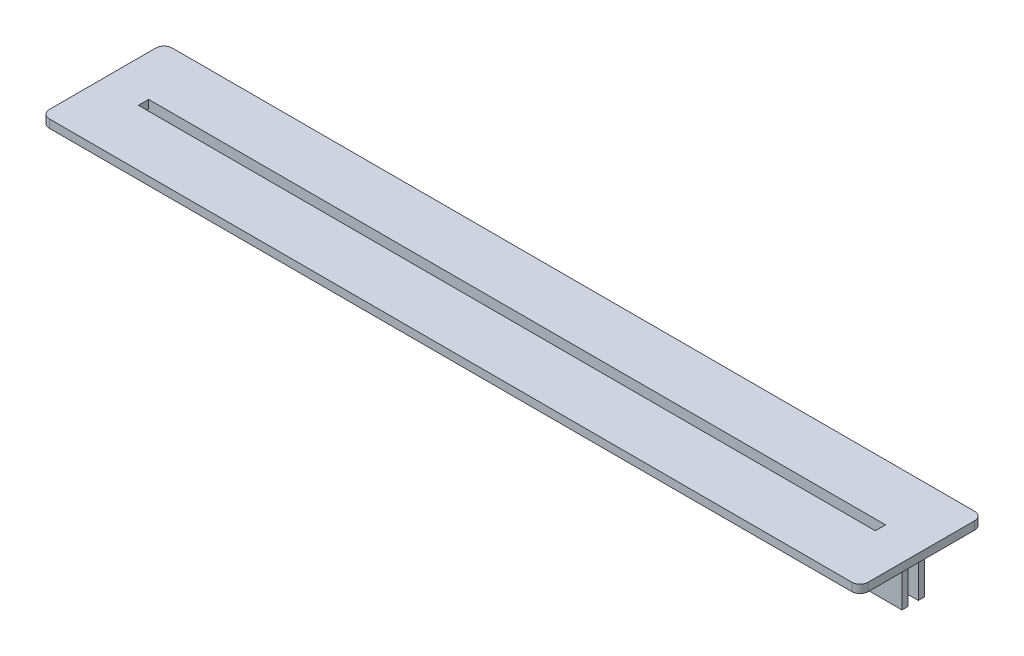
ISO-10303-21;
HEADER;
FILE_DESCRIPTION(('STEP AP214'),'2;1');
FILE_NAME('part.step','',(''),(''),'','','');
FILE_SCHEMA(('AUTOMOTIVE_DESIGN { 1 0 10303 214 1 1 1 1 }'));
ENDSEC;
DATA;
#1=APPLICATION_CONTEXT('core data for automotive mechanical design processes');
#2=APPLICATION_PROTOCOL_DEFINITION('international standard','automotive_design',2000,#1);
#3=PRODUCT_CONTEXT('',#1,'mechanical');
#4=PRODUCT('Part','Part','',(#3));
#5=PRODUCT_RELATED_PRODUCT_CATEGORY('part','',(#4));
#6=PRODUCT_DEFINITION_FORMATION('','',#4);
#7=PRODUCT_DEFINITION_CONTEXT('part definition',#1,'design');
#8=PRODUCT_DEFINITION('design','',#6,#7);
#9=PRODUCT_DEFINITION_SHAPE('','',#8);
#10=(LENGTH_UNIT() NAMED_UNIT(*) SI_UNIT(.MILLI.,.METRE.));
#11=(NAMED_UNIT(*) PLANE_ANGLE_UNIT() SI_UNIT($,.RADIAN.));
#12=(NAMED_UNIT(*) SI_UNIT($,.STERADIAN.) SOLID_ANGLE_UNIT());
#13=UNCERTAINTY_MEASURE_WITH_UNIT(LENGTH_MEASURE(1.E-05),#10,'distance_accuracy_value','');
#14=(GEOMETRIC_REPRESENTATION_CONTEXT(3) GLOBAL_UNCERTAINTY_ASSIGNED_CONTEXT((#13)) GLOBAL_UNIT_ASSIGNED_CONTEXT((#10,
#11,#12)) REPRESENTATION_CONTEXT('',''));
#15=CARTESIAN_POINT('',(0.,0.,0.));
#16=DIRECTION('',(0.,0.,1.));
#17=DIRECTION('',(1.,0.,0.));
#18=AXIS2_PLACEMENT_3D('',#15,#16,#17);
#19=CARTESIAN_POINT('',(124.46,0.,16.51));
#20=DIRECTION('',(0.,1.,0.));
#21=DIRECTION('',(0.,0.,1.));
#22=AXIS2_PLACEMENT_3D('',#19,#20,#21);
#23=PLANE('',#22);
#24=CARTESIAN_POINT('',(124.46,0.,16.51));
#25=DIRECTION('',(0.,1.,0.));
#26=DIRECTION('',(0.,0.,1.));
#27=AXIS2_PLACEMENT_3D('',#24,#25,#26);
#28=CIRCLE('',#27,2.53999999999999);
#29=CARTESIAN_POINT('',(124.46,0.,19.05));
#30=VERTEX_POINT('',#29);
#31=CARTESIAN_POINT('',(127.,0.,16.51));
#32=VERTEX_POINT('',#31);
#33=EDGE_CURVE('E273',#30,#32,#28,.T.);
#34=ORIENTED_EDGE('',*,*,#33,.F.);
#35=DIRECTION('',(1.,0.,0.));
#36=VECTOR('',#35,1.);
#37=CARTESIAN_POINT('',(-124.46,0.,19.05));
#38=LINE('',#37,#36);
#39=CARTESIAN_POINT('',(-124.46,0.,19.05));
#40=VERTEX_POINT('',#39);
#41=EDGE_CURVE('E310',#40,#30,#38,.T.);
#42=ORIENTED_EDGE('',*,*,#41,.F.);
#43=CARTESIAN_POINT('',(-124.46,0.,16.51));
#44=DIRECTION('',(0.,1.,0.));
#45=DIRECTION('',(0.,0.,1.));
#46=AXIS2_PLACEMENT_3D('',#43,#44,#45);
#47=CIRCLE('',#46,2.54);
#48=CARTESIAN_POINT('',(-127.,0.,16.51));
#49=VERTEX_POINT('',#48);
#50=EDGE_CURVE('E350',#49,#40,#47,.T.);
#51=ORIENTED_EDGE('',*,*,#50,.F.);
#52=DIRECTION('',(0.,0.,1.));
#53=VECTOR('',#52,1.);
#54=CARTESIAN_POINT('',(-127.,0.,-16.51));
#55=LINE('',#54,#53);
#56=CARTESIAN_POINT('',(-127.,0.,-16.51));
#57=VERTEX_POINT('',#56);
#58=EDGE_CURVE('E347',#57,#49,#55,.T.);
#59=ORIENTED_EDGE('',*,*,#58,.F.);
#60=CARTESIAN_POINT('',(-124.46,0.,-16.51));
#61=DIRECTION('',(0.,1.,0.));
#62=DIRECTION('',(0.,0.,1.));
#63=AXIS2_PLACEMENT_3D('',#60,#61,#62);
#64=CIRCLE('',#63,2.54);
#65=CARTESIAN_POINT('',(-124.46,0.,-19.05));
#66=VERTEX_POINT('',#65);
#67=EDGE_CURVE('E344',#66,#57,#64,.T.);
#68=ORIENTED_EDGE('',*,*,#67,.F.);
#69=DIRECTION('',(-1.,0.,0.));
#70=VECTOR('',#69,1.);
#71=CARTESIAN_POINT('',(-124.46,0.,-19.05));
#72=LINE('',#71,#70);
#73=CARTESIAN_POINT('',(124.46,0.,-19.05));
#74=VERTEX_POINT('',#73);
#75=EDGE_CURVE('E341',#74,#66,#72,.T.);
#76=ORIENTED_EDGE('',*,*,#75,.F.);
#77=CARTESIAN_POINT('',(124.46,0.,-16.51));
#78=DIRECTION('',(0.,1.,0.));
#79=DIRECTION('',(0.,0.,-1.));
#80=AXIS2_PLACEMENT_3D('',#77,#78,#79);
#81=CIRCLE('',#80,2.53999999999999);
#82=CARTESIAN_POINT('',(127.,0.,-16.51));
#83=VERTEX_POINT('',#82);
#84=EDGE_CURVE('E338',#83,#74,#81,.T.);
#85=ORIENTED_EDGE('',*,*,#84,.F.);
#86=DIRECTION('',(0.,0.,-1.));
#87=VECTOR('',#86,1.);
#88=CARTESIAN_POINT('',(127.,0.,-16.51));
#89=LINE('',#88,#87);
#90=EDGE_CURVE('E335',#32,#83,#89,.T.);
#91=ORIENTED_EDGE('',*,*,#90,.F.);
#92=EDGE_LOOP('',(#34,#42,#51,#59,#68,#76,#85,#91));
#93=FACE_BOUND('',#92,.T.);
#94=DIRECTION('',(-1.,0.,0.));
#95=VECTOR('',#94,1.);
#96=CARTESIAN_POINT('',(124.46,0.,-1.5875));
#97=LINE('',#96,#95);
#98=CARTESIAN_POINT('',(124.46,0.,-1.5875));
#99=VERTEX_POINT('',#98);
#100=CARTESIAN_POINT('',(114.3,0.,-1.5875));
#101=VERTEX_POINT('',#100);
#102=EDGE_CURVE('E636',#99,#101,#97,.T.);
#103=ORIENTED_EDGE('',*,*,#102,.F.);
#104=DIRECTION('',(0.,0.,1.));
#105=VECTOR('',#104,1.);
#106=CARTESIAN_POINT('',(124.46,0.,16.51));
#107=LINE('',#106,#105);
#108=CARTESIAN_POINT('',(124.46,0.,-3.4925));
#109=VERTEX_POINT('',#108);
#110=EDGE_CURVE('E212',#109,#99,#107,.T.);
#111=ORIENTED_EDGE('',*,*,#110,.F.);
#112=DIRECTION('',(1.,0.,0.));
#113=VECTOR('',#112,1.);
#114=CARTESIAN_POINT('',(124.46,0.,-3.4925));
#115=LINE('',#114,#113);
#116=CARTESIAN_POINT('',(-124.46,0.,-3.4925));
#117=VERTEX_POINT('',#116);
#118=EDGE_CURVE('E66',#117,#109,#115,.T.);
#119=ORIENTED_EDGE('',*,*,#118,.F.);
#120=DIRECTION('',(0.,0.,-1.));
#121=VECTOR('',#120,1.);
#122=CARTESIAN_POINT('',(-124.46,0.,16.51));
#123=LINE('',#122,#121);
#124=CARTESIAN_POINT('',(-124.46,0.,-1.5875));
#125=VERTEX_POINT('',#124);
#126=EDGE_CURVE('E61',#125,#117,#123,.T.);
#127=ORIENTED_EDGE('',*,*,#126,.F.);
#128=CARTESIAN_POINT('',(-114.3,0.,-1.5875));
#129=VERTEX_POINT('',#128);
#130=EDGE_CURVE('E217',#129,#125,#97,.T.);
#131=ORIENTED_EDGE('',*,*,#130,.F.);
#132=DIRECTION('',(0.,0.,1.));
#133=VECTOR('',#132,1.);
#134=CARTESIAN_POINT('',(-114.3,0.,16.51));
#135=LINE('',#134,#133);
#136=CARTESIAN_POINT('',(-114.3,0.,1.5875));
#137=VERTEX_POINT('',#136);
#138=EDGE_CURVE('E274',#129,#137,#135,.T.);
#139=ORIENTED_EDGE('',*,*,#138,.T.);
#140=DIRECTION('',(1.,0.,0.));
#141=VECTOR('',#140,1.);
#142=CARTESIAN_POINT('',(124.46,0.,1.5875));
#143=LINE('',#142,#141);
#144=CARTESIAN_POINT('',(-124.46,0.,1.5875));
#145=VERTEX_POINT('',#144);
#146=EDGE_CURVE('E54',#145,#137,#143,.T.);
#147=ORIENTED_EDGE('',*,*,#146,.F.);
#148=DIRECTION('',(0.,0.,-1.));
#149=VECTOR('',#148,1.);
#150=CARTESIAN_POINT('',(-124.46,0.,16.51));
#151=LINE('',#150,#149);
#152=CARTESIAN_POINT('',(-124.46,0.,3.4925));
#153=VERTEX_POINT('',#152);
#154=EDGE_CURVE('E224',#153,#145,#151,.T.);
#155=ORIENTED_EDGE('',*,*,#154,.F.);
#156=DIRECTION('',(-1.,0.,0.));
#157=VECTOR('',#156,1.);
#158=CARTESIAN_POINT('',(124.46,0.,3.4925));
#159=LINE('',#158,#157);
#160=CARTESIAN_POINT('',(124.46,0.,3.4925));
#161=VERTEX_POINT('',#160);
#162=EDGE_CURVE('E219',#161,#153,#159,.T.);
#163=ORIENTED_EDGE('',*,*,#162,.F.);
#164=DIRECTION('',(0.,0.,1.));
#165=VECTOR('',#164,1.);
#166=CARTESIAN_POINT('',(124.46,0.,16.51));
#167=LINE('',#166,#165);
#168=CARTESIAN_POINT('',(124.46,0.,1.5875));
#169=VERTEX_POINT('',#168);
#170=EDGE_CURVE('E235',#169,#161,#167,.T.);
#171=ORIENTED_EDGE('',*,*,#170,.F.);
#172=CARTESIAN_POINT('',(114.3,0.,1.5875));
#173=VERTEX_POINT('',#172);
#174=EDGE_CURVE('E11',#173,#169,#143,.T.);
#175=ORIENTED_EDGE('',*,*,#174,.F.);
#176=DIRECTION('',(0.,0.,-1.));
#177=VECTOR('',#176,1.);
#178=CARTESIAN_POINT('',(114.3,0.,16.51));
#179=LINE('',#178,#177);
#180=EDGE_CURVE('E269',#173,#101,#179,.T.);
#181=ORIENTED_EDGE('',*,*,#180,.T.);
#182=EDGE_LOOP('',(#103,#111,#119,#127,#131,#139,#147,#155,#163,#171,#175,#181));
#183=FACE_BOUND('',#182,.T.);
#184=ADVANCED_FACE('F43',(#93,#183),#23,.F.);
#185=CARTESIAN_POINT('',(124.46,2.54,16.51));
#186=DIRECTION('',(0.,1.,0.));
#187=DIRECTION('',(0.,0.,1.));
#188=AXIS2_PLACEMENT_3D('',#185,#186,#187);
#189=PLANE('',#188);
#190=CARTESIAN_POINT('',(124.46,2.54,16.51));
#191=DIRECTION('',(0.,1.,0.));
#192=DIRECTION('',(0.,0.,1.));
#193=AXIS2_PLACEMENT_3D('',#190,#191,#192);
#194=CIRCLE('',#193,2.53999999999999);
#195=CARTESIAN_POINT('',(124.46,2.54,19.05));
#196=VERTEX_POINT('',#195);
#197=CARTESIAN_POINT('',(127.,2.54,16.51));
#198=VERTEX_POINT('',#197);
#199=EDGE_CURVE('E305',#196,#198,#194,.T.);
#200=ORIENTED_EDGE('',*,*,#199,.T.);
#201=DIRECTION('',(0.,0.,-1.));
#202=VECTOR('',#201,1.);
#203=CARTESIAN_POINT('',(127.,2.54,-16.51));
#204=LINE('',#203,#202);
#205=CARTESIAN_POINT('',(127.,2.54,-16.51));
#206=VERTEX_POINT('',#205);
#207=EDGE_CURVE('E309',#198,#206,#204,.T.);
#208=ORIENTED_EDGE('',*,*,#207,.T.);
#209=CARTESIAN_POINT('',(124.46,2.54,-16.51));
#210=DIRECTION('',(0.,1.,0.));
#211=DIRECTION('',(0.,0.,-1.));
#212=AXIS2_PLACEMENT_3D('',#209,#210,#211);
#213=CIRCLE('',#212,2.53999999999999);
#214=CARTESIAN_POINT('',(124.46,2.54,-19.05));
#215=VERTEX_POINT('',#214);
#216=EDGE_CURVE('E313',#206,#215,#213,.T.);
#217=ORIENTED_EDGE('',*,*,#216,.T.);
#218=DIRECTION('',(-1.,0.,0.));
#219=VECTOR('',#218,1.);
#220=CARTESIAN_POINT('',(-124.46,2.54,-19.05));
#221=LINE('',#220,#219);
#222=CARTESIAN_POINT('',(-124.46,2.54,-19.05));
#223=VERTEX_POINT('',#222);
#224=EDGE_CURVE('E316',#215,#223,#221,.T.);
#225=ORIENTED_EDGE('',*,*,#224,.T.);
#226=CARTESIAN_POINT('',(-124.46,2.54,-16.51));
#227=DIRECTION('',(0.,1.,0.));
#228=DIRECTION('',(0.,0.,1.));
#229=AXIS2_PLACEMENT_3D('',#226,#227,#228);
#230=CIRCLE('',#229,2.54);
#231=CARTESIAN_POINT('',(-127.,2.54,-16.51));
#232=VERTEX_POINT('',#231);
#233=EDGE_CURVE('E319',#223,#232,#230,.T.);
#234=ORIENTED_EDGE('',*,*,#233,.T.);
#235=DIRECTION('',(0.,0.,1.));
#236=VECTOR('',#235,1.);
#237=CARTESIAN_POINT('',(-127.,2.54,-16.51));
#238=LINE('',#237,#236);
#239=CARTESIAN_POINT('',(-127.,2.54,16.51));
#240=VERTEX_POINT('',#239);
#241=EDGE_CURVE('E322',#232,#240,#238,.T.);
#242=ORIENTED_EDGE('',*,*,#241,.T.);
#243=CARTESIAN_POINT('',(-124.46,2.54,16.51));
#244=DIRECTION('',(0.,1.,0.));
#245=DIRECTION('',(0.,0.,1.));
#246=AXIS2_PLACEMENT_3D('',#243,#244,#245);
#247=CIRCLE('',#246,2.54);
#248=CARTESIAN_POINT('',(-124.46,2.54,19.05));
#249=VERTEX_POINT('',#248);
#250=EDGE_CURVE('E325',#240,#249,#247,.T.);
#251=ORIENTED_EDGE('',*,*,#250,.T.);
#252=DIRECTION('',(1.,0.,0.));
#253=VECTOR('',#252,1.);
#254=CARTESIAN_POINT('',(-124.46,2.54,19.05));
#255=LINE('',#254,#253);
#256=EDGE_CURVE('E328',#249,#196,#255,.T.);
#257=ORIENTED_EDGE('',*,*,#256,.T.);
#258=EDGE_LOOP('',(#200,#208,#217,#225,#234,#242,#251,#257));
#259=FACE_BOUND('',#258,.T.);
#260=DIRECTION('',(-1.,0.,0.));
#261=VECTOR('',#260,1.);
#262=CARTESIAN_POINT('',(124.46,2.54,1.5875));
#263=LINE('',#262,#261);
#264=CARTESIAN_POINT('',(114.3,2.54,1.5875));
#265=VERTEX_POINT('',#264);
#266=CARTESIAN_POINT('',(-114.3,2.54,1.5875));
#267=VERTEX_POINT('',#266);
#268=EDGE_CURVE('E282',#265,#267,#263,.T.);
#269=ORIENTED_EDGE('',*,*,#268,.T.);
#270=DIRECTION('',(0.,0.,-1.));
#271=VECTOR('',#270,1.);
#272=CARTESIAN_POINT('',(-114.3,2.54,16.51));
#273=LINE('',#272,#271);
#274=CARTESIAN_POINT('',(-114.3,2.54,-1.5875));
#275=VERTEX_POINT('',#274);
#276=EDGE_CURVE('E286',#267,#275,#273,.T.);
#277=ORIENTED_EDGE('',*,*,#276,.T.);
#278=DIRECTION('',(1.,0.,0.));
#279=VECTOR('',#278,1.);
#280=CARTESIAN_POINT('',(124.46,2.54,-1.5875));
#281=LINE('',#280,#279);
#282=CARTESIAN_POINT('',(114.3,2.54,-1.5875));
#283=VERTEX_POINT('',#282);
#284=EDGE_CURVE('E268',#275,#283,#281,.T.);
#285=ORIENTED_EDGE('',*,*,#284,.T.);
#286=DIRECTION('',(0.,0.,1.));
#287=VECTOR('',#286,1.);
#288=CARTESIAN_POINT('',(114.3,2.54,16.51));
#289=LINE('',#288,#287);
#290=EDGE_CURVE('E278',#283,#265,#289,.T.);
#291=ORIENTED_EDGE('',*,*,#290,.T.);
#292=EDGE_LOOP('',(#269,#277,#285,#291));
#293=FACE_BOUND('',#292,.T.);
#294=ADVANCED_FACE('F406',(#259,#293),#189,.T.);
#295=CARTESIAN_POINT('',(124.46,2.54,16.51));
#296=DIRECTION('',(0.,-1.,0.));
#297=DIRECTION('',(0.,0.,-1.));
#298=AXIS2_PLACEMENT_3D('',#295,#296,#297);
#299=CYLINDRICAL_SURFACE('',#298,2.53999999999999);
#300=ORIENTED_EDGE('',*,*,#33,.T.);
#301=DIRECTION('',(0.,-1.,0.));
#302=VECTOR('',#301,1.);
#303=CARTESIAN_POINT('',(127.,2.54,16.51));
#304=LINE('',#303,#302);
#305=EDGE_CURVE('E47',#198,#32,#304,.T.);
#306=ORIENTED_EDGE('',*,*,#305,.F.);
#307=ORIENTED_EDGE('',*,*,#199,.F.);
#308=DIRECTION('',(0.,-1.,0.));
#309=VECTOR('',#308,1.);
#310=CARTESIAN_POINT('',(124.46,2.54,19.05));
#311=LINE('',#310,#309);
#312=EDGE_CURVE('E331',#196,#30,#311,.T.);
#313=ORIENTED_EDGE('',*,*,#312,.T.);
#314=EDGE_LOOP('',(#300,#306,#307,#313));
#315=FACE_BOUND('',#314,.T.);
#316=ADVANCED_FACE('F45',(#315),#299,.T.);
#317=CARTESIAN_POINT('',(127.,2.54,-16.51));
#318=DIRECTION('',(-1.,0.,0.));
#319=DIRECTION('',(0.,0.,1.));
#320=AXIS2_PLACEMENT_3D('',#317,#318,#319);
#321=PLANE('',#320);
#322=ORIENTED_EDGE('',*,*,#90,.T.);
#323=DIRECTION('',(0.,-1.,0.));
#324=VECTOR('',#323,1.);
#325=CARTESIAN_POINT('',(127.,2.54,-16.51));
#326=LINE('',#325,#324);
#327=EDGE_CURVE('E377',#206,#83,#326,.T.);
#328=ORIENTED_EDGE('',*,*,#327,.F.);
#329=ORIENTED_EDGE('',*,*,#207,.F.);
#330=ORIENTED_EDGE('',*,*,#305,.T.);
#331=EDGE_LOOP('',(#322,#328,#329,#330));
#332=FACE_BOUND('',#331,.T.);
#333=ADVANCED_FACE('F388',(#332),#321,.F.);
#334=CARTESIAN_POINT('',(124.46,2.54,-16.51));
#335=DIRECTION('',(0.,-1.,0.));
#336=DIRECTION('',(0.,0.,-1.));
#337=AXIS2_PLACEMENT_3D('',#334,#335,#336);
#338=CYLINDRICAL_SURFACE('',#337,2.53999999999999);
#339=ORIENTED_EDGE('',*,*,#84,.T.);
#340=DIRECTION('',(0.,-1.,0.));
#341=VECTOR('',#340,1.);
#342=CARTESIAN_POINT('',(124.46,2.54,-19.05));
#343=LINE('',#342,#341);
#344=EDGE_CURVE('E374',#215,#74,#343,.T.);
#345=ORIENTED_EDGE('',*,*,#344,.F.);
#346=ORIENTED_EDGE('',*,*,#216,.F.);
#347=ORIENTED_EDGE('',*,*,#327,.T.);
#348=EDGE_LOOP('',(#339,#345,#346,#347));
#349=FACE_BOUND('',#348,.T.);
#350=ADVANCED_FACE('F399',(#349),#338,.T.);
#351=CARTESIAN_POINT('',(-124.46,2.54,-19.05));
#352=DIRECTION('',(0.,0.,1.));
#353=DIRECTION('',(1.,0.,0.));
#354=AXIS2_PLACEMENT_3D('',#351,#352,#353);
#355=PLANE('',#354);
#356=ORIENTED_EDGE('',*,*,#75,.T.);
#357=DIRECTION('',(0.,-1.,0.));
#358=VECTOR('',#357,1.);
#359=CARTESIAN_POINT('',(-124.46,2.54,-19.05));
#360=LINE('',#359,#358);
#361=EDGE_CURVE('E370',#223,#66,#360,.T.);
#362=ORIENTED_EDGE('',*,*,#361,.F.);
#363=ORIENTED_EDGE('',*,*,#224,.F.);
#364=ORIENTED_EDGE('',*,*,#344,.T.);
#365=EDGE_LOOP('',(#356,#362,#363,#364));
#366=FACE_BOUND('',#365,.T.);
#367=ADVANCED_FACE('F402',(#366),#355,.F.);
#368=CARTESIAN_POINT('',(-124.46,2.54,-16.51));
#369=DIRECTION('',(0.,-1.,0.));
#370=DIRECTION('',(0.,0.,-1.));
#371=AXIS2_PLACEMENT_3D('',#368,#369,#370);
#372=CYLINDRICAL_SURFACE('',#371,2.54);
#373=ORIENTED_EDGE('',*,*,#67,.T.);
#374=DIRECTION('',(0.,-1.,0.));
#375=VECTOR('',#374,1.);
#376=CARTESIAN_POINT('',(-127.,2.54,-16.51));
#377=LINE('',#376,#375);
#378=EDGE_CURVE('E366',#232,#57,#377,.T.);
#379=ORIENTED_EDGE('',*,*,#378,.F.);
#380=ORIENTED_EDGE('',*,*,#233,.F.);
#381=ORIENTED_EDGE('',*,*,#361,.T.);
#382=EDGE_LOOP('',(#373,#379,#380,#381));
#383=FACE_BOUND('',#382,.T.);
#384=ADVANCED_FACE('F422',(#383),#372,.T.);
#385=CARTESIAN_POINT('',(-127.,2.54,-16.51));
#386=DIRECTION('',(1.,0.,0.));
#387=DIRECTION('',(0.,0.,-1.));
#388=AXIS2_PLACEMENT_3D('',#385,#386,#387);
#389=PLANE('',#388);
#390=ORIENTED_EDGE('',*,*,#58,.T.);
#391=DIRECTION('',(0.,-1.,0.));
#392=VECTOR('',#391,1.);
#393=CARTESIAN_POINT('',(-127.,2.54,16.51));
#394=LINE('',#393,#392);
#395=EDGE_CURVE('E362',#240,#49,#394,.T.);
#396=ORIENTED_EDGE('',*,*,#395,.F.);
#397=ORIENTED_EDGE('',*,*,#241,.F.);
#398=ORIENTED_EDGE('',*,*,#378,.T.);
#399=EDGE_LOOP('',(#390,#396,#397,#398));
#400=FACE_BOUND('',#399,.T.);
#401=ADVANCED_FACE('F419',(#400),#389,.F.);
#402=CARTESIAN_POINT('',(-124.46,2.54,16.51));
#403=DIRECTION('',(0.,-1.,0.));
#404=DIRECTION('',(0.,0.,-1.));
#405=AXIS2_PLACEMENT_3D('',#402,#403,#404);
#406=CYLINDRICAL_SURFACE('',#405,2.54);
#407=ORIENTED_EDGE('',*,*,#50,.T.);
#408=DIRECTION('',(0.,-1.,0.));
#409=VECTOR('',#408,1.);
#410=CARTESIAN_POINT('',(-124.46,2.54,19.05));
#411=LINE('',#410,#409);
#412=EDGE_CURVE('E358',#249,#40,#411,.T.);
#413=ORIENTED_EDGE('',*,*,#412,.F.);
#414=ORIENTED_EDGE('',*,*,#250,.F.);
#415=ORIENTED_EDGE('',*,*,#395,.T.);
#416=EDGE_LOOP('',(#407,#413,#414,#415));
#417=FACE_BOUND('',#416,.T.);
#418=ADVANCED_FACE('F415',(#417),#406,.T.);
#419=CARTESIAN_POINT('',(-124.46,2.54,19.05));
#420=DIRECTION('',(0.,0.,-1.));
#421=DIRECTION('',(-1.,0.,0.));
#422=AXIS2_PLACEMENT_3D('',#419,#420,#421);
#423=PLANE('',#422);
#424=ORIENTED_EDGE('',*,*,#41,.T.);
#425=ORIENTED_EDGE('',*,*,#312,.F.);
#426=ORIENTED_EDGE('',*,*,#256,.F.);
#427=ORIENTED_EDGE('',*,*,#412,.T.);
#428=EDGE_LOOP('',(#424,#425,#426,#427));
#429=FACE_BOUND('',#428,.T.);
#430=ADVANCED_FACE('F413',(#429),#423,.F.);
#431=CARTESIAN_POINT('',(-114.3,-228.622047547913,16.51));
#432=DIRECTION('',(1.,0.,0.));
#433=DIRECTION('',(0.,0.,-1.));
#434=AXIS2_PLACEMENT_3D('',#431,#432,#433);
#435=PLANE('',#434);
#436=DIRECTION('',(0.,1.,0.));
#437=VECTOR('',#436,1.);
#438=CARTESIAN_POINT('',(-114.3,-228.622047547913,-1.5875));
#439=LINE('',#438,#437);
#440=EDGE_CURVE('E290',#129,#275,#439,.T.);
#441=ORIENTED_EDGE('',*,*,#440,.T.);
#442=ORIENTED_EDGE('',*,*,#276,.F.);
#443=DIRECTION('',(0.,1.,0.));
#444=VECTOR('',#443,1.);
#445=CARTESIAN_POINT('',(-114.3,-228.622047547913,1.5875));
#446=LINE('',#445,#444);
#447=EDGE_CURVE('E293',#137,#267,#446,.T.);
#448=ORIENTED_EDGE('',*,*,#447,.F.);
#449=ORIENTED_EDGE('',*,*,#138,.F.);
#450=EDGE_LOOP('',(#441,#442,#448,#449));
#451=FACE_BOUND('',#450,.T.);
#452=ADVANCED_FACE('F441',(#451),#435,.T.);
#453=CARTESIAN_POINT('',(124.46,-228.622047547913,1.5875));
#454=DIRECTION('',(0.,0.,-1.));
#455=DIRECTION('',(-1.,0.,0.));
#456=AXIS2_PLACEMENT_3D('',#453,#454,#455);
#457=PLANE('',#456);
#458=ORIENTED_EDGE('',*,*,#447,.T.);
#459=ORIENTED_EDGE('',*,*,#268,.F.);
#460=DIRECTION('',(0.,1.,0.));
#461=VECTOR('',#460,1.);
#462=CARTESIAN_POINT('',(114.3,-228.622047547913,1.5875));
#463=LINE('',#462,#461);
#464=EDGE_CURVE('E296',#173,#265,#463,.T.);
#465=ORIENTED_EDGE('',*,*,#464,.F.);
#466=ORIENTED_EDGE('',*,*,#174,.T.);
#467=DIRECTION('',(0.,1.,0.));
#468=VECTOR('',#467,1.);
#469=CARTESIAN_POINT('',(124.46,-12.7,1.5875));
#470=LINE('',#469,#468);
#471=CARTESIAN_POINT('',(124.46,-12.7,1.5875));
#472=VERTEX_POINT('',#471);
#473=EDGE_CURVE('E256',#472,#169,#470,.T.);
#474=ORIENTED_EDGE('',*,*,#473,.F.);
#475=DIRECTION('',(1.,0.,0.));
#476=VECTOR('',#475,1.);
#477=CARTESIAN_POINT('',(124.46,-12.7,1.5875));
#478=LINE('',#477,#476);
#479=CARTESIAN_POINT('',(-124.46,-12.7,1.5875));
#480=VERTEX_POINT('',#479);
#481=EDGE_CURVE('E238',#480,#472,#478,.T.);
#482=ORIENTED_EDGE('',*,*,#481,.F.);
#483=DIRECTION('',(0.,1.,0.));
#484=VECTOR('',#483,1.);
#485=CARTESIAN_POINT('',(-124.46,-12.7,1.5875));
#486=LINE('',#485,#484);
#487=EDGE_CURVE('E260',#480,#145,#486,.T.);
#488=ORIENTED_EDGE('',*,*,#487,.T.);
#489=ORIENTED_EDGE('',*,*,#146,.T.);
#490=EDGE_LOOP('',(#458,#459,#465,#466,#474,#482,#488,#489));
#491=FACE_BOUND('',#490,.T.);
#492=ADVANCED_FACE('F458',(#491),#457,.T.);
#493=CARTESIAN_POINT('',(114.3,-228.622047547913,16.51));
#494=DIRECTION('',(-1.,0.,0.));
#495=DIRECTION('',(0.,0.,1.));
#496=AXIS2_PLACEMENT_3D('',#493,#494,#495);
#497=PLANE('',#496);
#498=ORIENTED_EDGE('',*,*,#464,.T.);
#499=ORIENTED_EDGE('',*,*,#290,.F.);
#500=DIRECTION('',(0.,1.,0.));
#501=VECTOR('',#500,1.);
#502=CARTESIAN_POINT('',(114.3,-228.622047547913,-1.5875));
#503=LINE('',#502,#501);
#504=EDGE_CURVE('E299',#101,#283,#503,.T.);
#505=ORIENTED_EDGE('',*,*,#504,.F.);
#506=ORIENTED_EDGE('',*,*,#180,.F.);
#507=EDGE_LOOP('',(#498,#499,#505,#506));
#508=FACE_BOUND('',#507,.T.);
#509=ADVANCED_FACE('F467',(#508),#497,.T.);
#510=CARTESIAN_POINT('',(124.46,-228.622047547913,-1.5875));
#511=DIRECTION('',(0.,0.,1.));
#512=DIRECTION('',(1.,0.,0.));
#513=AXIS2_PLACEMENT_3D('',#510,#511,#512);
#514=PLANE('',#513);
#515=ORIENTED_EDGE('',*,*,#504,.T.);
#516=ORIENTED_EDGE('',*,*,#284,.F.);
#517=ORIENTED_EDGE('',*,*,#440,.F.);
#518=ORIENTED_EDGE('',*,*,#130,.T.);
#519=DIRECTION('',(0.,1.,0.));
#520=VECTOR('',#519,1.);
#521=CARTESIAN_POINT('',(-124.46,-12.7,-1.5875));
#522=LINE('',#521,#520);
#523=CARTESIAN_POINT('',(-124.46,-12.7,-1.5875));
#524=VERTEX_POINT('',#523);
#525=EDGE_CURVE('E195',#524,#125,#522,.T.);
#526=ORIENTED_EDGE('',*,*,#525,.F.);
#527=DIRECTION('',(-1.,0.,0.));
#528=VECTOR('',#527,1.);
#529=CARTESIAN_POINT('',(124.46,-12.7,-1.5875));
#530=LINE('',#529,#528);
#531=CARTESIAN_POINT('',(124.46,-12.7,-1.5875));
#532=VERTEX_POINT('',#531);
#533=EDGE_CURVE('E202',#532,#524,#530,.T.);
#534=ORIENTED_EDGE('',*,*,#533,.F.);
#535=DIRECTION('',(0.,1.,0.));
#536=VECTOR('',#535,1.);
#537=CARTESIAN_POINT('',(124.46,-12.7,-1.5875));
#538=LINE('',#537,#536);
#539=EDGE_CURVE('E631',#532,#99,#538,.T.);
#540=ORIENTED_EDGE('',*,*,#539,.T.);
#541=ORIENTED_EDGE('',*,*,#102,.T.);
#542=EDGE_LOOP('',(#515,#516,#517,#518,#526,#534,#540,#541));
#543=FACE_BOUND('',#542,.T.);
#544=ADVANCED_FACE('F215',(#543),#514,.T.);
#545=CARTESIAN_POINT('',(124.46,-12.7,3.4925));
#546=DIRECTION('',(0.,0.,-1.));
#547=DIRECTION('',(-1.,0.,0.));
#548=AXIS2_PLACEMENT_3D('',#545,#546,#547);
#549=PLANE('',#548);
#550=ORIENTED_EDGE('',*,*,#162,.T.);
#551=DIRECTION('',(0.,1.,0.));
#552=VECTOR('',#551,1.);
#553=CARTESIAN_POINT('',(-124.46,-12.7,3.4925));
#554=LINE('',#553,#552);
#555=CARTESIAN_POINT('',(-124.46,-12.7,3.4925));
#556=VERTEX_POINT('',#555);
#557=EDGE_CURVE('E264',#556,#153,#554,.T.);
#558=ORIENTED_EDGE('',*,*,#557,.F.);
#559=DIRECTION('',(-1.,0.,0.));
#560=VECTOR('',#559,1.);
#561=CARTESIAN_POINT('',(124.46,-12.7,3.4925));
#562=LINE('',#561,#560);
#563=CARTESIAN_POINT('',(124.46,-12.7,3.4925));
#564=VERTEX_POINT('',#563);
#565=EDGE_CURVE('E230',#564,#556,#562,.T.);
#566=ORIENTED_EDGE('',*,*,#565,.F.);
#567=DIRECTION('',(0.,1.,0.));
#568=VECTOR('',#567,1.);
#569=CARTESIAN_POINT('',(124.46,-12.7,3.4925));
#570=LINE('',#569,#568);
#571=EDGE_CURVE('E243',#564,#161,#570,.T.);
#572=ORIENTED_EDGE('',*,*,#571,.T.);
#573=EDGE_LOOP('',(#550,#558,#566,#572));
#574=FACE_BOUND('',#573,.T.);
#575=ADVANCED_FACE('F482',(#574),#549,.F.);
#576=CARTESIAN_POINT('',(-124.46,-12.7,16.51));
#577=DIRECTION('',(1.,0.,0.));
#578=DIRECTION('',(0.,0.,-1.));
#579=AXIS2_PLACEMENT_3D('',#576,#577,#578);
#580=PLANE('',#579);
#581=ORIENTED_EDGE('',*,*,#154,.T.);
#582=ORIENTED_EDGE('',*,*,#487,.F.);
#583=DIRECTION('',(0.,0.,-1.));
#584=VECTOR('',#583,1.);
#585=CARTESIAN_POINT('',(-124.46,-12.7,16.51));
#586=LINE('',#585,#584);
#587=EDGE_CURVE('E234',#556,#480,#586,.T.);
#588=ORIENTED_EDGE('',*,*,#587,.F.);
#589=ORIENTED_EDGE('',*,*,#557,.T.);
#590=EDGE_LOOP('',(#581,#582,#588,#589));
#591=FACE_BOUND('',#590,.T.);
#592=ADVANCED_FACE('F486',(#591),#580,.F.);
#593=CARTESIAN_POINT('',(124.46,-12.7,16.51));
#594=DIRECTION('',(-1.,0.,0.));
#595=DIRECTION('',(0.,0.,1.));
#596=AXIS2_PLACEMENT_3D('',#593,#594,#595);
#597=PLANE('',#596);
#598=ORIENTED_EDGE('',*,*,#170,.T.);
#599=ORIENTED_EDGE('',*,*,#571,.F.);
#600=DIRECTION('',(0.,0.,1.));
#601=VECTOR('',#600,1.);
#602=CARTESIAN_POINT('',(124.46,-12.7,16.51));
#603=LINE('',#602,#601);
#604=EDGE_CURVE('E241',#472,#564,#603,.T.);
#605=ORIENTED_EDGE('',*,*,#604,.F.);
#606=ORIENTED_EDGE('',*,*,#473,.T.);
#607=EDGE_LOOP('',(#598,#599,#605,#606));
#608=FACE_BOUND('',#607,.T.);
#609=ADVANCED_FACE('F494',(#608),#597,.F.);
#610=CARTESIAN_POINT('',(0.,-12.7,0.));
#611=DIRECTION('',(0.,-1.,0.));
#612=DIRECTION('',(0.,0.,-1.));
#613=AXIS2_PLACEMENT_3D('',#610,#611,#612);
#614=PLANE('',#613);
#615=ORIENTED_EDGE('',*,*,#565,.T.);
#616=ORIENTED_EDGE('',*,*,#587,.T.);
#617=ORIENTED_EDGE('',*,*,#481,.T.);
#618=ORIENTED_EDGE('',*,*,#604,.T.);
#619=EDGE_LOOP('',(#615,#616,#617,#618));
#620=FACE_BOUND('',#619,.T.);
#621=ADVANCED_FACE('F502',(#620),#614,.T.);
#622=CARTESIAN_POINT('',(-124.46,-12.7,16.51));
#623=DIRECTION('',(1.,0.,0.));
#624=DIRECTION('',(0.,0.,-1.));
#625=AXIS2_PLACEMENT_3D('',#622,#623,#624);
#626=PLANE('',#625);
#627=ORIENTED_EDGE('',*,*,#126,.T.);
#628=DIRECTION('',(0.,1.,0.));
#629=VECTOR('',#628,1.);
#630=CARTESIAN_POINT('',(-124.46,-12.7,-3.4925));
#631=LINE('',#630,#629);
#632=CARTESIAN_POINT('',(-124.46,-12.7,-3.4925));
#633=VERTEX_POINT('',#632);
#634=EDGE_CURVE('E197',#633,#117,#631,.T.);
#635=ORIENTED_EDGE('',*,*,#634,.F.);
#636=DIRECTION('',(0.,0.,-1.));
#637=VECTOR('',#636,1.);
#638=CARTESIAN_POINT('',(-124.46,-12.7,16.51));
#639=LINE('',#638,#637);
#640=EDGE_CURVE('E191',#524,#633,#639,.T.);
#641=ORIENTED_EDGE('',*,*,#640,.F.);
#642=ORIENTED_EDGE('',*,*,#525,.T.);
#643=EDGE_LOOP('',(#627,#635,#641,#642));
#644=FACE_BOUND('',#643,.T.);
#645=ADVANCED_FACE('F193',(#644),#626,.F.);
#646=CARTESIAN_POINT('',(124.46,-12.7,-3.4925));
#647=DIRECTION('',(0.,0.,1.));
#648=DIRECTION('',(1.,0.,0.));
#649=AXIS2_PLACEMENT_3D('',#646,#647,#648);
#650=PLANE('',#649);
#651=ORIENTED_EDGE('',*,*,#118,.T.);
#652=DIRECTION('',(0.,1.,0.));
#653=VECTOR('',#652,1.);
#654=CARTESIAN_POINT('',(124.46,-12.7,-3.4925));
#655=LINE('',#654,#653);
#656=CARTESIAN_POINT('',(124.46,-12.7,-3.4925));
#657=VERTEX_POINT('',#656);
#658=EDGE_CURVE('E226',#657,#109,#655,.T.);
#659=ORIENTED_EDGE('',*,*,#658,.F.);
#660=DIRECTION('',(1.,0.,0.));
#661=VECTOR('',#660,1.);
#662=CARTESIAN_POINT('',(124.46,-12.7,-3.4925));
#663=LINE('',#662,#661);
#664=EDGE_CURVE('E201',#633,#657,#663,.T.);
#665=ORIENTED_EDGE('',*,*,#664,.F.);
#666=ORIENTED_EDGE('',*,*,#634,.T.);
#667=EDGE_LOOP('',(#651,#659,#665,#666));
#668=FACE_BOUND('',#667,.T.);
#669=ADVANCED_FACE('F518',(#668),#650,.F.);
#670=CARTESIAN_POINT('',(124.46,-12.7,16.51));
#671=DIRECTION('',(-1.,0.,0.));
#672=DIRECTION('',(0.,0.,1.));
#673=AXIS2_PLACEMENT_3D('',#670,#671,#672);
#674=PLANE('',#673);
#675=ORIENTED_EDGE('',*,*,#110,.T.);
#676=ORIENTED_EDGE('',*,*,#539,.F.);
#677=DIRECTION('',(0.,0.,1.));
#678=VECTOR('',#677,1.);
#679=CARTESIAN_POINT('',(124.46,-12.7,16.51));
#680=LINE('',#679,#678);
#681=EDGE_CURVE('E207',#657,#532,#680,.T.);
#682=ORIENTED_EDGE('',*,*,#681,.F.);
#683=ORIENTED_EDGE('',*,*,#658,.T.);
#684=EDGE_LOOP('',(#675,#676,#682,#683));
#685=FACE_BOUND('',#684,.T.);
#686=ADVANCED_FACE('F525',(#685),#674,.F.);
#687=CARTESIAN_POINT('',(0.,-12.7,0.));
#688=DIRECTION('',(0.,-1.,0.));
#689=DIRECTION('',(0.,0.,-1.));
#690=AXIS2_PLACEMENT_3D('',#687,#688,#689);
#691=PLANE('',#690);
#692=ORIENTED_EDGE('',*,*,#533,.T.);
#693=ORIENTED_EDGE('',*,*,#640,.T.);
#694=ORIENTED_EDGE('',*,*,#664,.T.);
#695=ORIENTED_EDGE('',*,*,#681,.T.);
#696=EDGE_LOOP('',(#692,#693,#694,#695));
#697=FACE_BOUND('',#696,.T.);
#698=ADVANCED_FACE('F205',(#697),#691,.T.);
#699=CLOSED_SHELL('',(#184,#294,#316,#333,#350,#367,#384,#401,#418,#430,#452,#492,#509,#544,
#575,#592,#609,#621,#645,#669,#686,#698));
#700=MANIFOLD_SOLID_BREP('B2',#699);
#701=ADVANCED_BREP_SHAPE_REPRESENTATION('',(#18,#700),#14);
#702=SHAPE_DEFINITION_REPRESENTATION(#9,#701);
ENDSEC;
END-ISO-10303-21;
